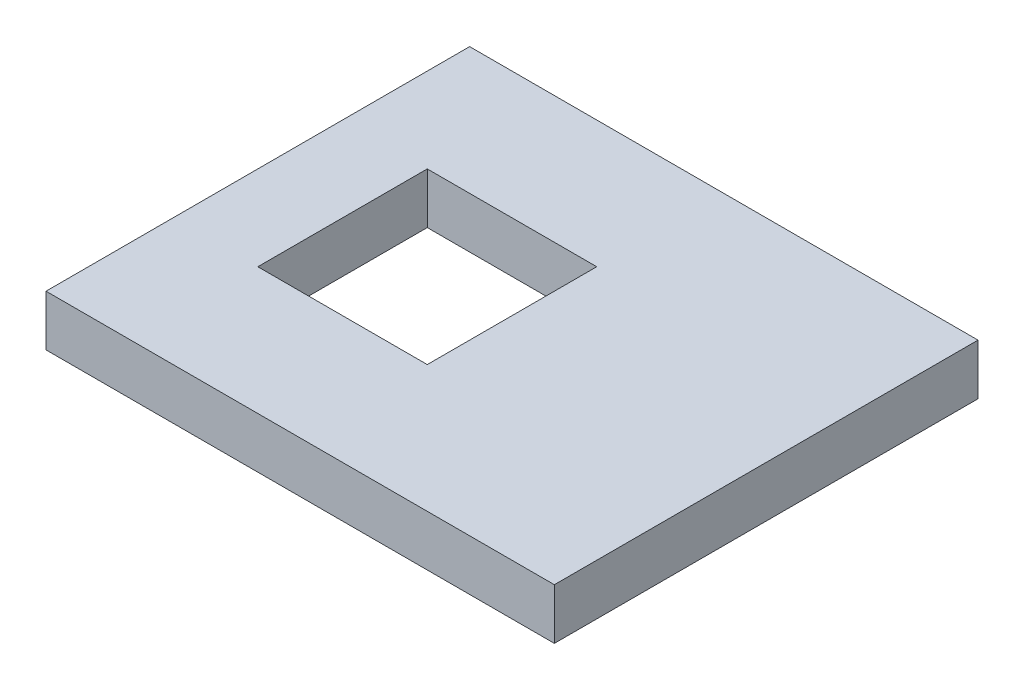
ISO-10303-21;
HEADER;
FILE_DESCRIPTION(('STEP AP214'),'2;1');
FILE_NAME('part.step','',(''),(''),'','','');
FILE_SCHEMA(('AUTOMOTIVE_DESIGN { 1 0 10303 214 1 1 1 1 }'));
ENDSEC;
DATA;
#1=APPLICATION_CONTEXT('core data for automotive mechanical design processes');
#2=APPLICATION_PROTOCOL_DEFINITION('international standard','automotive_design',2000,#1);
#3=PRODUCT_CONTEXT('',#1,'mechanical');
#4=PRODUCT('Part','Part','',(#3));
#5=PRODUCT_RELATED_PRODUCT_CATEGORY('part','',(#4));
#6=PRODUCT_DEFINITION_FORMATION('','',#4);
#7=PRODUCT_DEFINITION_CONTEXT('part definition',#1,'design');
#8=PRODUCT_DEFINITION('design','',#6,#7);
#9=PRODUCT_DEFINITION_SHAPE('','',#8);
#10=(LENGTH_UNIT() NAMED_UNIT(*) SI_UNIT(.MILLI.,.METRE.));
#11=(NAMED_UNIT(*) PLANE_ANGLE_UNIT() SI_UNIT($,.RADIAN.));
#12=(NAMED_UNIT(*) SI_UNIT($,.STERADIAN.) SOLID_ANGLE_UNIT());
#13=UNCERTAINTY_MEASURE_WITH_UNIT(LENGTH_MEASURE(1.E-05),#10,'distance_accuracy_value','');
#14=(GEOMETRIC_REPRESENTATION_CONTEXT(3) GLOBAL_UNCERTAINTY_ASSIGNED_CONTEXT((#13)) GLOBAL_UNIT_ASSIGNED_CONTEXT((#10,
#11,#12)) REPRESENTATION_CONTEXT('',''));
#15=CARTESIAN_POINT('',(0.,0.,0.));
#16=DIRECTION('',(0.,0.,1.));
#17=DIRECTION('',(1.,0.,0.));
#18=AXIS2_PLACEMENT_3D('',#15,#16,#17);
#19=CARTESIAN_POINT('',(-15.9090909090909,3.,-12.5));
#20=DIRECTION('',(1.,0.,0.));
#21=DIRECTION('',(0.,0.,-1.));
#22=AXIS2_PLACEMENT_3D('',#19,#20,#21);
#23=PLANE('',#22);
#24=DIRECTION('',(0.,0.,1.));
#25=VECTOR('',#24,1.);
#26=CARTESIAN_POINT('',(-15.9090909090909,0.,-12.5));
#27=LINE('',#26,#25);
#28=CARTESIAN_POINT('',(-15.9090909090909,0.,-12.5));
#29=VERTEX_POINT('',#28);
#30=CARTESIAN_POINT('',(-15.9090909090909,0.,12.5));
#31=VERTEX_POINT('',#30);
#32=EDGE_CURVE('E146',#29,#31,#27,.T.);
#33=ORIENTED_EDGE('',*,*,#32,.T.);
#34=DIRECTION('',(0.,-1.,0.));
#35=VECTOR('',#34,1.);
#36=CARTESIAN_POINT('',(-15.9090909090909,3.,12.5));
#37=LINE('',#36,#35);
#38=CARTESIAN_POINT('',(-15.9090909090909,3.,12.5));
#39=VERTEX_POINT('',#38);
#40=EDGE_CURVE('E11',#39,#31,#37,.T.);
#41=ORIENTED_EDGE('',*,*,#40,.F.);
#42=DIRECTION('',(0.,0.,1.));
#43=VECTOR('',#42,1.);
#44=CARTESIAN_POINT('',(-15.9090909090909,3.,-12.5));
#45=LINE('',#44,#43);
#46=CARTESIAN_POINT('',(-15.9090909090909,3.,-12.5));
#47=VERTEX_POINT('',#46);
#48=EDGE_CURVE('E152',#47,#39,#45,.T.);
#49=ORIENTED_EDGE('',*,*,#48,.F.);
#50=DIRECTION('',(0.,-1.,0.));
#51=VECTOR('',#50,1.);
#52=CARTESIAN_POINT('',(-15.9090909090909,3.,-12.5));
#53=LINE('',#52,#51);
#54=EDGE_CURVE('E166',#47,#29,#53,.T.);
#55=ORIENTED_EDGE('',*,*,#54,.T.);
#56=EDGE_LOOP('',(#33,#41,#49,#55));
#57=FACE_BOUND('',#56,.T.);
#58=ADVANCED_FACE('F38',(#57),#23,.F.);
#59=CARTESIAN_POINT('',(-15.9090909090909,3.,12.5));
#60=DIRECTION('',(0.,0.,-1.));
#61=DIRECTION('',(-1.,0.,0.));
#62=AXIS2_PLACEMENT_3D('',#59,#60,#61);
#63=PLANE('',#62);
#64=DIRECTION('',(1.,0.,0.));
#65=VECTOR('',#64,1.);
#66=CARTESIAN_POINT('',(-15.9090909090909,0.,12.5));
#67=LINE('',#66,#65);
#68=CARTESIAN_POINT('',(14.0909090909091,0.,12.5));
#69=VERTEX_POINT('',#68);
#70=EDGE_CURVE('E170',#31,#69,#67,.T.);
#71=ORIENTED_EDGE('',*,*,#70,.T.);
#72=DIRECTION('',(0.,-1.,0.));
#73=VECTOR('',#72,1.);
#74=CARTESIAN_POINT('',(14.0909090909091,3.,12.5));
#75=LINE('',#74,#73);
#76=CARTESIAN_POINT('',(14.0909090909091,3.,12.5));
#77=VERTEX_POINT('',#76);
#78=EDGE_CURVE('E46',#77,#69,#75,.T.);
#79=ORIENTED_EDGE('',*,*,#78,.F.);
#80=DIRECTION('',(1.,0.,0.));
#81=VECTOR('',#80,1.);
#82=CARTESIAN_POINT('',(-15.9090909090909,3.,12.5));
#83=LINE('',#82,#81);
#84=EDGE_CURVE('E156',#39,#77,#83,.T.);
#85=ORIENTED_EDGE('',*,*,#84,.F.);
#86=ORIENTED_EDGE('',*,*,#40,.T.);
#87=EDGE_LOOP('',(#71,#79,#85,#86));
#88=FACE_BOUND('',#87,.T.);
#89=ADVANCED_FACE('F204',(#88),#63,.F.);
#90=CARTESIAN_POINT('',(14.0909090909091,3.,-12.5));
#91=DIRECTION('',(-1.,0.,0.));
#92=DIRECTION('',(0.,0.,1.));
#93=AXIS2_PLACEMENT_3D('',#90,#91,#92);
#94=PLANE('',#93);
#95=DIRECTION('',(0.,0.,-1.));
#96=VECTOR('',#95,1.);
#97=CARTESIAN_POINT('',(14.0909090909091,0.,-12.5));
#98=LINE('',#97,#96);
#99=CARTESIAN_POINT('',(14.0909090909091,0.,-12.5));
#100=VERTEX_POINT('',#99);
#101=EDGE_CURVE('E173',#69,#100,#98,.T.);
#102=ORIENTED_EDGE('',*,*,#101,.T.);
#103=DIRECTION('',(0.,-1.,0.));
#104=VECTOR('',#103,1.);
#105=CARTESIAN_POINT('',(14.0909090909091,3.,-12.5));
#106=LINE('',#105,#104);
#107=CARTESIAN_POINT('',(14.0909090909091,3.,-12.5));
#108=VERTEX_POINT('',#107);
#109=EDGE_CURVE('E181',#108,#100,#106,.T.);
#110=ORIENTED_EDGE('',*,*,#109,.F.);
#111=DIRECTION('',(0.,0.,-1.));
#112=VECTOR('',#111,1.);
#113=CARTESIAN_POINT('',(14.0909090909091,3.,-12.5));
#114=LINE('',#113,#112);
#115=EDGE_CURVE('E160',#77,#108,#114,.T.);
#116=ORIENTED_EDGE('',*,*,#115,.F.);
#117=ORIENTED_EDGE('',*,*,#78,.T.);
#118=EDGE_LOOP('',(#102,#110,#116,#117));
#119=FACE_BOUND('',#118,.T.);
#120=ADVANCED_FACE('F190',(#119),#94,.F.);
#121=CARTESIAN_POINT('',(-15.9090909090909,3.,-12.5));
#122=DIRECTION('',(0.,0.,1.));
#123=DIRECTION('',(1.,0.,0.));
#124=AXIS2_PLACEMENT_3D('',#121,#122,#123);
#125=PLANE('',#124);
#126=DIRECTION('',(-1.,0.,0.));
#127=VECTOR('',#126,1.);
#128=CARTESIAN_POINT('',(-15.9090909090909,0.,-12.5));
#129=LINE('',#128,#127);
#130=EDGE_CURVE('E157',#100,#29,#129,.T.);
#131=ORIENTED_EDGE('',*,*,#130,.T.);
#132=ORIENTED_EDGE('',*,*,#54,.F.);
#133=DIRECTION('',(-1.,0.,0.));
#134=VECTOR('',#133,1.);
#135=CARTESIAN_POINT('',(-15.9090909090909,3.,-12.5));
#136=LINE('',#135,#134);
#137=EDGE_CURVE('E163',#108,#47,#136,.T.);
#138=ORIENTED_EDGE('',*,*,#137,.F.);
#139=ORIENTED_EDGE('',*,*,#109,.T.);
#140=EDGE_LOOP('',(#131,#132,#138,#139));
#141=FACE_BOUND('',#140,.T.);
#142=ADVANCED_FACE('F197',(#141),#125,.F.);
#143=CARTESIAN_POINT('',(0.,3.,0.));
#144=DIRECTION('',(0.,1.,0.));
#145=DIRECTION('',(0.,0.,1.));
#146=AXIS2_PLACEMENT_3D('',#143,#144,#145);
#147=PLANE('',#146);
#148=DIRECTION('',(0.,0.,1.));
#149=VECTOR('',#148,1.);
#150=CARTESIAN_POINT('',(-10.9090909090909,3.,-5.));
#151=LINE('',#150,#149);
#152=CARTESIAN_POINT('',(-10.9090909090909,3.,-5.));
#153=VERTEX_POINT('',#152);
#154=CARTESIAN_POINT('',(-10.9090909090909,3.,5.));
#155=VERTEX_POINT('',#154);
#156=EDGE_CURVE('E53',#153,#155,#151,.T.);
#157=ORIENTED_EDGE('',*,*,#156,.F.);
#158=DIRECTION('',(-1.,0.,0.));
#159=VECTOR('',#158,1.);
#160=CARTESIAN_POINT('',(-10.9090909090909,3.,-5.));
#161=LINE('',#160,#159);
#162=CARTESIAN_POINT('',(-0.909090909090923,3.,-5.));
#163=VERTEX_POINT('',#162);
#164=EDGE_CURVE('E124',#163,#153,#161,.T.);
#165=ORIENTED_EDGE('',*,*,#164,.F.);
#166=DIRECTION('',(0.,0.,-1.));
#167=VECTOR('',#166,1.);
#168=CARTESIAN_POINT('',(-0.909090909090923,3.,-5.));
#169=LINE('',#168,#167);
#170=CARTESIAN_POINT('',(-0.909090909090923,3.,5.));
#171=VERTEX_POINT('',#170);
#172=EDGE_CURVE('E128',#171,#163,#169,.T.);
#173=ORIENTED_EDGE('',*,*,#172,.F.);
#174=DIRECTION('',(1.,0.,0.));
#175=VECTOR('',#174,1.);
#176=CARTESIAN_POINT('',(-10.9090909090909,3.,5.));
#177=LINE('',#176,#175);
#178=EDGE_CURVE('E137',#155,#171,#177,.T.);
#179=ORIENTED_EDGE('',*,*,#178,.F.);
#180=EDGE_LOOP('',(#157,#165,#173,#179));
#181=FACE_BOUND('',#180,.T.);
#182=ORIENTED_EDGE('',*,*,#48,.T.);
#183=ORIENTED_EDGE('',*,*,#84,.T.);
#184=ORIENTED_EDGE('',*,*,#115,.T.);
#185=ORIENTED_EDGE('',*,*,#137,.T.);
#186=EDGE_LOOP('',(#182,#183,#184,#185));
#187=FACE_BOUND('',#186,.T.);
#188=ADVANCED_FACE('F203',(#181,#187),#147,.T.);
#189=CARTESIAN_POINT('',(0.,0.,0.));
#190=DIRECTION('',(0.,1.,0.));
#191=DIRECTION('',(0.,0.,1.));
#192=AXIS2_PLACEMENT_3D('',#189,#190,#191);
#193=PLANE('',#192);
#194=DIRECTION('',(-1.,0.,0.));
#195=VECTOR('',#194,1.);
#196=CARTESIAN_POINT('',(-10.9090909090909,0.,-5.));
#197=LINE('',#196,#195);
#198=CARTESIAN_POINT('',(-0.909090909090923,0.,-5.));
#199=VERTEX_POINT('',#198);
#200=CARTESIAN_POINT('',(-10.9090909090909,0.,-5.));
#201=VERTEX_POINT('',#200);
#202=EDGE_CURVE('E112',#199,#201,#197,.T.);
#203=ORIENTED_EDGE('',*,*,#202,.T.);
#204=DIRECTION('',(0.,0.,1.));
#205=VECTOR('',#204,1.);
#206=CARTESIAN_POINT('',(-10.9090909090909,0.,-5.));
#207=LINE('',#206,#205);
#208=CARTESIAN_POINT('',(-10.9090909090909,0.,5.));
#209=VERTEX_POINT('',#208);
#210=EDGE_CURVE('E105',#201,#209,#207,.T.);
#211=ORIENTED_EDGE('',*,*,#210,.T.);
#212=DIRECTION('',(1.,0.,0.));
#213=VECTOR('',#212,1.);
#214=CARTESIAN_POINT('',(-10.9090909090909,0.,5.));
#215=LINE('',#214,#213);
#216=CARTESIAN_POINT('',(-0.909090909090923,0.,5.));
#217=VERTEX_POINT('',#216);
#218=EDGE_CURVE('E115',#209,#217,#215,.T.);
#219=ORIENTED_EDGE('',*,*,#218,.T.);
#220=DIRECTION('',(0.,0.,-1.));
#221=VECTOR('',#220,1.);
#222=CARTESIAN_POINT('',(-0.909090909090923,0.,-5.));
#223=LINE('',#222,#221);
#224=EDGE_CURVE('E61',#217,#199,#223,.T.);
#225=ORIENTED_EDGE('',*,*,#224,.T.);
#226=EDGE_LOOP('',(#203,#211,#219,#225));
#227=FACE_BOUND('',#226,.T.);
#228=ORIENTED_EDGE('',*,*,#32,.F.);
#229=ORIENTED_EDGE('',*,*,#130,.F.);
#230=ORIENTED_EDGE('',*,*,#101,.F.);
#231=ORIENTED_EDGE('',*,*,#70,.F.);
#232=EDGE_LOOP('',(#228,#229,#230,#231));
#233=FACE_BOUND('',#232,.T.);
#234=ADVANCED_FACE('F120',(#227,#233),#193,.F.);
#235=CARTESIAN_POINT('',(-10.9090909090909,0.,-5.));
#236=DIRECTION('',(-1.,0.,0.));
#237=DIRECTION('',(0.,0.,1.));
#238=AXIS2_PLACEMENT_3D('',#235,#236,#237);
#239=PLANE('',#238);
#240=ORIENTED_EDGE('',*,*,#156,.T.);
#241=DIRECTION('',(0.,1.,0.));
#242=VECTOR('',#241,1.);
#243=CARTESIAN_POINT('',(-10.9090909090909,0.,5.));
#244=LINE('',#243,#242);
#245=EDGE_CURVE('E101',#209,#155,#244,.T.);
#246=ORIENTED_EDGE('',*,*,#245,.F.);
#247=ORIENTED_EDGE('',*,*,#210,.F.);
#248=DIRECTION('',(0.,1.,0.));
#249=VECTOR('',#248,1.);
#250=CARTESIAN_POINT('',(-10.9090909090909,0.,-5.));
#251=LINE('',#250,#249);
#252=EDGE_CURVE('E143',#201,#153,#251,.T.);
#253=ORIENTED_EDGE('',*,*,#252,.T.);
#254=EDGE_LOOP('',(#240,#246,#247,#253));
#255=FACE_BOUND('',#254,.T.);
#256=ADVANCED_FACE('F103',(#255),#239,.F.);
#257=CARTESIAN_POINT('',(-10.9090909090909,0.,-5.));
#258=DIRECTION('',(0.,0.,-1.));
#259=DIRECTION('',(-1.,0.,0.));
#260=AXIS2_PLACEMENT_3D('',#257,#258,#259);
#261=PLANE('',#260);
#262=ORIENTED_EDGE('',*,*,#164,.T.);
#263=ORIENTED_EDGE('',*,*,#252,.F.);
#264=ORIENTED_EDGE('',*,*,#202,.F.);
#265=DIRECTION('',(0.,1.,0.));
#266=VECTOR('',#265,1.);
#267=CARTESIAN_POINT('',(-0.909090909090923,0.,-5.));
#268=LINE('',#267,#266);
#269=EDGE_CURVE('E147',#199,#163,#268,.T.);
#270=ORIENTED_EDGE('',*,*,#269,.T.);
#271=EDGE_LOOP('',(#262,#263,#264,#270));
#272=FACE_BOUND('',#271,.T.);
#273=ADVANCED_FACE('F221',(#272),#261,.F.);
#274=CARTESIAN_POINT('',(-0.909090909090923,0.,-5.));
#275=DIRECTION('',(1.,0.,0.));
#276=DIRECTION('',(0.,0.,-1.));
#277=AXIS2_PLACEMENT_3D('',#274,#275,#276);
#278=PLANE('',#277);
#279=ORIENTED_EDGE('',*,*,#172,.T.);
#280=ORIENTED_EDGE('',*,*,#269,.F.);
#281=ORIENTED_EDGE('',*,*,#224,.F.);
#282=DIRECTION('',(0.,1.,0.));
#283=VECTOR('',#282,1.);
#284=CARTESIAN_POINT('',(-0.909090909090923,0.,5.));
#285=LINE('',#284,#283);
#286=EDGE_CURVE('E111',#217,#171,#285,.T.);
#287=ORIENTED_EDGE('',*,*,#286,.T.);
#288=EDGE_LOOP('',(#279,#280,#281,#287));
#289=FACE_BOUND('',#288,.T.);
#290=ADVANCED_FACE('F224',(#289),#278,.F.);
#291=CARTESIAN_POINT('',(-10.9090909090909,0.,5.));
#292=DIRECTION('',(0.,0.,1.));
#293=DIRECTION('',(1.,0.,0.));
#294=AXIS2_PLACEMENT_3D('',#291,#292,#293);
#295=PLANE('',#294);
#296=ORIENTED_EDGE('',*,*,#178,.T.);
#297=ORIENTED_EDGE('',*,*,#286,.F.);
#298=ORIENTED_EDGE('',*,*,#218,.F.);
#299=ORIENTED_EDGE('',*,*,#245,.T.);
#300=EDGE_LOOP('',(#296,#297,#298,#299));
#301=FACE_BOUND('',#300,.T.);
#302=ADVANCED_FACE('F116',(#301),#295,.F.);
#303=CLOSED_SHELL('',(#58,#89,#120,#142,#188,#234,#256,#273,#290,#302));
#304=MANIFOLD_SOLID_BREP('B2',#303);
#305=ADVANCED_BREP_SHAPE_REPRESENTATION('',(#18,#304),#14);
#306=SHAPE_DEFINITION_REPRESENTATION(#9,#305);
ENDSEC;
END-ISO-10303-21;
